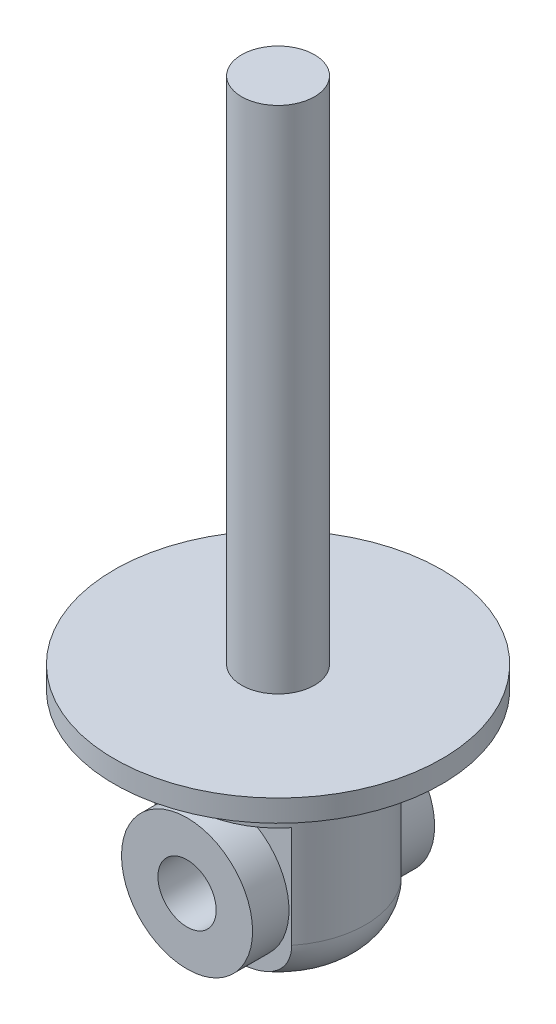
ISO-10303-21;
HEADER;
FILE_DESCRIPTION(('STEP AP214'),'2;1');
FILE_NAME('part.step','',(''),(''),'','','');
FILE_SCHEMA(('AUTOMOTIVE_DESIGN { 1 0 10303 214 1 1 1 1 }'));
ENDSEC;
DATA;
#1=APPLICATION_CONTEXT('core data for automotive mechanical design processes');
#2=APPLICATION_PROTOCOL_DEFINITION('international standard','automotive_design',2000,#1);
#3=PRODUCT_CONTEXT('',#1,'mechanical');
#4=PRODUCT('Part','Part','',(#3));
#5=PRODUCT_RELATED_PRODUCT_CATEGORY('part','',(#4));
#6=PRODUCT_DEFINITION_FORMATION('','',#4);
#7=PRODUCT_DEFINITION_CONTEXT('part definition',#1,'design');
#8=PRODUCT_DEFINITION('design','',#6,#7);
#9=PRODUCT_DEFINITION_SHAPE('','',#8);
#10=(LENGTH_UNIT() NAMED_UNIT(*) SI_UNIT(.MILLI.,.METRE.));
#11=(NAMED_UNIT(*) PLANE_ANGLE_UNIT() SI_UNIT($,.RADIAN.));
#12=(NAMED_UNIT(*) SI_UNIT($,.STERADIAN.) SOLID_ANGLE_UNIT());
#13=UNCERTAINTY_MEASURE_WITH_UNIT(LENGTH_MEASURE(1.E-05),#10,'distance_accuracy_value','');
#14=(GEOMETRIC_REPRESENTATION_CONTEXT(3) GLOBAL_UNCERTAINTY_ASSIGNED_CONTEXT((#13)) GLOBAL_UNIT_ASSIGNED_CONTEXT((#10,
#11,#12)) REPRESENTATION_CONTEXT('',''));
#15=CARTESIAN_POINT('',(0.,0.,0.));
#16=DIRECTION('',(0.,0.,1.));
#17=DIRECTION('',(1.,0.,0.));
#18=AXIS2_PLACEMENT_3D('',#15,#16,#17);
#19=CARTESIAN_POINT('',(-22.5,-11.,7.5));
#20=DIRECTION('',(0.,0.,-1.));
#21=DIRECTION('',(-1.,0.,0.));
#22=AXIS2_PLACEMENT_3D('',#19,#20,#21);
#23=PLANE('',#22);
#24=CARTESIAN_POINT('',(0.,-30.8094750193111,7.5));
#25=CARTESIAN_POINT('',(-0.184521628242417,-30.8094752958151,7.5));
#26=CARTESIAN_POINT('',(-0.369043480287189,-30.8077270322999,7.5));
#27=CARTESIAN_POINT('',(-0.737999394292283,-30.8006130628877,7.5));
#28=CARTESIAN_POINT('',(-0.922433463434383,-30.7952477367066,7.5));
#29=CARTESIAN_POINT('',(-1.29122559425462,-30.780538513706,7.5));
#30=CARTESIAN_POINT('',(-1.47558358999919,-30.7711929215574,7.5));
#31=CARTESIAN_POINT('',(-1.84401846668315,-30.7479507640883,7.5));
#32=CARTESIAN_POINT('',(-2.02809534398339,-30.734054140347,7.5));
#33=CARTESIAN_POINT('',(-2.39498843631837,-30.701027325669,7.5));
#34=CARTESIAN_POINT('',(-2.57780665418326,-30.6819201299087,7.5));
#35=CARTESIAN_POINT('',(-2.94269408038083,-30.6375682217561,7.5));
#36=CARTESIAN_POINT('',(-3.12476323156505,-30.6123230495969,7.5));
#37=CARTESIAN_POINT('',(-3.6691632505479,-30.5259360262262,7.5));
#38=CARTESIAN_POINT('',(-4.02997739530099,-30.4541196223952,7.5));
#39=CARTESIAN_POINT('',(-4.57935988961709,-30.315114172541,7.5));
#40=CARTESIAN_POINT('',(-4.77122256452969,-30.2608348848703,7.5));
#41=CARTESIAN_POINT('',(-5.15109529504942,-30.1402411036094,7.5));
#42=CARTESIAN_POINT('',(-5.33910680786539,-30.0739312594077,7.5));
#43=CARTESIAN_POINT('',(-5.70992505463463,-29.928148698992,7.5));
#44=CARTESIAN_POINT('',(-5.8927332791208,-29.8486797977089,7.5));
#45=CARTESIAN_POINT('',(-6.25155879665883,-29.6756224712841,7.5));
#46=CARTESIAN_POINT('',(-6.42757723883459,-29.5820364486502,7.5));
#47=CARTESIAN_POINT('',(-6.74413785402998,-29.3958384208508,7.5));
#48=CARTESIAN_POINT('',(-6.8859302136676,-29.3053527427416,7.5));
#49=CARTESIAN_POINT('',(-7.16205254122039,-29.1136422044668,7.5));
#50=CARTESIAN_POINT('',(-7.29638393401336,-29.0124194056704,7.5));
#51=CARTESIAN_POINT('',(-7.55627452274061,-28.7991822855038,7.5));
#52=CARTESIAN_POINT('',(-7.6818315054992,-28.6871652583255,7.5));
#53=CARTESIAN_POINT('',(-7.92270374400352,-28.4525813942248,7.5));
#54=CARTESIAN_POINT('',(-8.03801892249803,-28.3300144777409,7.5));
#55=CARTESIAN_POINT('',(-8.25792234562975,-28.0736714823962,7.5));
#56=CARTESIAN_POINT('',(-8.36240569865935,-27.9398051473305,7.5));
#57=CARTESIAN_POINT('',(-8.55796576900281,-27.662616920615,7.5));
#58=CARTESIAN_POINT('',(-8.64904436046082,-27.5192963548439,7.5));
#59=CARTESIAN_POINT('',(-8.81636481076626,-27.2243409104845,7.5));
#60=CARTESIAN_POINT('',(-8.89261579636783,-27.0727112205185,7.5));
#61=CARTESIAN_POINT('',(-9.02909243430965,-26.7624095052739,7.5));
#62=CARTESIAN_POINT('',(-9.08932115899453,-26.6037388369551,7.5));
#63=CARTESIAN_POINT('',(-9.18495143349039,-26.3052245459151,7.5));
#64=CARTESIAN_POINT('',(-9.22272405795733,-26.1661361294911,7.5));
#65=CARTESIAN_POINT('',(-9.28547940350163,-25.8851087613884,7.5));
#66=CARTESIAN_POINT('',(-9.31046370365637,-25.7431701638949,7.5));
#67=CARTESIAN_POINT('',(-9.34730641699015,-25.4576599589478,7.5));
#68=CARTESIAN_POINT('',(-9.35917031033292,-25.3140890586128,7.5));
#69=CARTESIAN_POINT('',(-9.36963164548865,-25.0264648581988,7.5));
#70=CARTESIAN_POINT('',(-9.36822954903947,-24.8824115750842,7.5));
#71=CARTESIAN_POINT('',(-9.35280339576898,-24.6061914815275,7.5));
#72=CARTESIAN_POINT('',(-9.33976569953801,-24.4739684759154,7.5));
#73=CARTESIAN_POINT('',(-9.3025636387872,-24.2110534946456,7.5));
#74=CARTESIAN_POINT('',(-9.27839574533065,-24.0803620180608,7.5));
#75=CARTESIAN_POINT('',(-9.21922065645586,-23.8215410609612,7.5));
#76=CARTESIAN_POINT('',(-9.1842198149556,-23.6934101253726,7.5));
#77=CARTESIAN_POINT('',(-9.1037455253616,-23.4404340442512,7.5));
#78=CARTESIAN_POINT('',(-9.05826815366643,-23.3155901493276,7.5));
#79=CARTESIAN_POINT('',(-8.95699564520569,-23.0692031015505,7.5));
#80=CARTESIAN_POINT('',(-8.90113499399755,-22.9476868658852,7.5));
#81=CARTESIAN_POINT('',(-8.77987692751896,-22.7094920695403,7.5));
#82=CARTESIAN_POINT('',(-8.71447610526942,-22.5928152563103,7.5));
#83=CARTESIAN_POINT('',(-8.50489875856371,-22.2509911073174,7.5));
#84=CARTESIAN_POINT('',(-8.34729299116934,-22.0339195251877,7.5));
#85=CARTESIAN_POINT('',(-7.98870608163152,-21.609337427954,7.5));
#86=CARTESIAN_POINT('',(-7.785297559506,-21.4039002281567,7.5));
#87=CARTESIAN_POINT('',(-7.35109040646742,-21.0246758733926,7.5));
#88=CARTESIAN_POINT('',(-7.12029612399674,-20.8508837047537,7.5));
#89=CARTESIAN_POINT('',(-6.69864287979114,-20.5744409595824,7.5));
#90=CARTESIAN_POINT('',(-6.51223410047272,-20.4648689537028,7.5));
#91=CARTESIAN_POINT('',(-6.13034538679085,-20.2626904112623,7.5));
#92=CARTESIAN_POINT('',(-5.93486117014358,-20.1700919878543,7.5));
#93=CARTESIAN_POINT('',(-5.53658641063457,-20.0006313082269,7.5));
#94=CARTESIAN_POINT('',(-5.33377659321379,-19.9238147555949,7.5));
#95=CARTESIAN_POINT('',(-4.92331428460809,-19.784875362625,7.5));
#96=CARTESIAN_POINT('',(-4.71566315546473,-19.7227484430634,7.5));
#97=CARTESIAN_POINT('',(-4.02250667384635,-19.5386673542947,7.5));
#98=CARTESIAN_POINT('',(-3.52942656369881,-19.4449803111871,7.5));
#99=CARTESIAN_POINT('',(-2.78498720051466,-19.3412352530644,7.5));
#100=CARTESIAN_POINT('',(-2.53568557770049,-19.3127705467372,7.5));
#101=CARTESIAN_POINT('',(-2.03612434937438,-19.2658269581612,7.5));
#102=CARTESIAN_POINT('',(-1.78586486368141,-19.2473468655649,7.5));
#103=CARTESIAN_POINT('',(-1.28363112408652,-19.2184283009414,7.5));
#104=CARTESIAN_POINT('',(-1.03165466176091,-19.208031590786,7.5));
#105=CARTESIAN_POINT('',(-0.527501194688673,-19.1941849220444,7.5));
#106=CARTESIAN_POINT('',(-0.275324180848904,-19.1907352988047,7.5));
#107=CARTESIAN_POINT('',(0.228731345602984,-19.1903333462322,7.5));
#108=CARTESIAN_POINT('',(0.480609853630182,-19.193373232494,7.5));
#109=CARTESIAN_POINT('',(0.984173581494276,-19.2063332691715,7.5));
#110=CARTESIAN_POINT('',(1.23585881660875,-19.2162528039697,7.5));
#111=CARTESIAN_POINT('',(1.76278825668935,-19.2454935008677,7.5));
#112=CARTESIAN_POINT('',(2.03798990109172,-19.2656211327378,7.5));
#113=CARTESIAN_POINT('',(2.58731345976839,-19.3180418431018,7.5));
#114=CARTESIAN_POINT('',(2.86143522597445,-19.3503365349836,7.5));
#115=CARTESIAN_POINT('',(3.40623279358437,-19.4300545548583,7.5));
#116=CARTESIAN_POINT('',(3.67691867401874,-19.4774071358833,7.5));
#117=CARTESIAN_POINT('',(4.21439476079952,-19.5907053400646,7.5));
#118=CARTESIAN_POINT('',(4.4811862031647,-19.6566449229111,7.5));
#119=CARTESIAN_POINT('',(4.94217748017443,-19.7911834026755,7.5));
#120=CARTESIAN_POINT('',(5.13778160857808,-19.8549558474619,7.5));
#121=CARTESIAN_POINT('',(5.5239942274174,-19.9961265709521,7.5));
#122=CARTESIAN_POINT('',(5.71460418712137,-20.073520789267,7.5));
#123=CARTESIAN_POINT('',(6.0892198722189,-20.2430793617625,7.5));
#124=CARTESIAN_POINT('',(6.27322442084439,-20.3352463319138,7.5));
#125=CARTESIAN_POINT('',(6.63256976145457,-20.5351759469553,7.5));
#126=CARTESIAN_POINT('',(6.80791280693598,-20.6429345063483,7.5));
#127=CARTESIAN_POINT('',(7.10989658300674,-20.8487615005737,7.5));
#128=CARTESIAN_POINT('',(7.23870103997639,-20.9436617626469,7.5));
#129=CARTESIAN_POINT('',(7.48856622066219,-21.143229826346,7.5));
#130=CARTESIAN_POINT('',(7.60962602152205,-21.2478987883735,7.5));
#131=CARTESIAN_POINT('',(7.84271387792474,-21.4668045949393,7.5));
#132=CARTESIAN_POINT('',(7.95474473789612,-21.5810384459287,7.5));
#133=CARTESIAN_POINT('',(8.16854933672494,-21.8187268203134,7.5));
#134=CARTESIAN_POINT('',(8.27032449994957,-21.9421800591116,7.5));
#135=CARTESIAN_POINT('',(8.46313596223061,-22.1987356397018,7.5));
#136=CARTESIAN_POINT('',(8.55408255407203,-22.3319055781875,7.5));
#137=CARTESIAN_POINT('',(8.72304401015934,-22.6061418402457,7.5));
#138=CARTESIAN_POINT('',(8.80106500403696,-22.747204378254,7.5));
#139=CARTESIAN_POINT('',(8.94309470867639,-23.0362068877473,7.5));
#140=CARTESIAN_POINT('',(9.00710515749598,-23.1841460034049,7.5));
#141=CARTESIAN_POINT('',(9.12014361193693,-23.4856380297523,7.5));
#142=CARTESIAN_POINT('',(9.16917373274798,-23.6391901444676,7.5));
#143=CARTESIAN_POINT('',(9.24643392787081,-23.9313639562727,7.5));
#144=CARTESIAN_POINT('',(9.27647685632879,-24.0695088202567,7.5));
#145=CARTESIAN_POINT('',(9.32406143536891,-24.3479315795213,7.5));
#146=CARTESIAN_POINT('',(9.34160421520928,-24.4882092809527,7.5));
#147=CARTESIAN_POINT('',(9.36396002322678,-24.769719609589,7.5));
#148=CARTESIAN_POINT('',(9.36877802253041,-24.9109518422674,7.5));
#149=CARTESIAN_POINT('',(9.36563613906261,-25.1932734390957,7.5));
#150=CARTESIAN_POINT('',(9.35767657732182,-25.3343628067459,7.5));
#151=CARTESIAN_POINT('',(9.32998563551062,-25.6064011749062,7.5));
#152=CARTESIAN_POINT('',(9.31102660205279,-25.7374295539783,7.5));
#153=CARTESIAN_POINT('',(9.26218788836622,-25.9974780227225,7.5));
#154=CARTESIAN_POINT('',(9.23230470755187,-26.1264974548056,7.5));
#155=CARTESIAN_POINT('',(9.16196479385525,-26.3815508516768,7.5));
#156=CARTESIAN_POINT('',(9.12151307666088,-26.5075862018084,7.5));
#157=CARTESIAN_POINT('',(9.03044888037393,-26.7559772755244,7.5));
#158=CARTESIAN_POINT('',(8.97983258590813,-26.8783315975104,7.5));
#159=CARTESIAN_POINT('',(8.8680617574251,-27.1205569584555,7.5));
#160=CARTESIAN_POINT('',(8.80674877020291,-27.2403549182387,7.5));
#161=CARTESIAN_POINT('',(8.67480187441993,-27.4747211723639,7.5));
#162=CARTESIAN_POINT('',(8.60416462323317,-27.5892875713423,7.5));
#163=CARTESIAN_POINT('',(8.37928997825773,-27.9242270275788,7.5));
#164=CARTESIAN_POINT('',(8.21201407264852,-28.13600210755,7.5));
#165=CARTESIAN_POINT('',(7.83294273917801,-28.5504485361803,7.5));
#166=CARTESIAN_POINT('',(7.618532285847,-28.7507010772538,7.5));
#167=CARTESIAN_POINT('',(7.16337882817299,-29.1185076671662,7.5));
#168=CARTESIAN_POINT('',(6.9226275303298,-29.2860513710234,7.5));
#169=CARTESIAN_POINT('',(6.4788664395953,-29.5545024709803,7.5));
#170=CARTESIAN_POINT('',(6.279707295078,-29.6619013252763,7.5));
#171=CARTESIAN_POINT('',(5.87254463104013,-29.858559219587,7.5));
#172=CARTESIAN_POINT('',(5.66453691936401,-29.9478095430477,7.5));
#173=CARTESIAN_POINT('',(5.24180758530233,-30.1096214973705,7.5));
#174=CARTESIAN_POINT('',(5.02707553901332,-30.1821555960046,7.5));
#175=CARTESIAN_POINT('',(4.59305326757357,-30.3121001369762,7.5));
#176=CARTESIAN_POINT('',(4.37376133898657,-30.3695048137837,7.5));
#177=CARTESIAN_POINT('',(3.81417726059938,-30.4981886749365,7.5));
#178=CARTESIAN_POINT('',(3.4718329690517,-30.5604951716191,7.5));
#179=CARTESIAN_POINT('',(2.7835920061487,-30.6609019684328,7.5));
#180=CARTESIAN_POINT('',(2.43769315620306,-30.6989863972919,7.5));
#181=CARTESIAN_POINT('',(1.91723181279188,-30.7425563308733,7.5));
#182=CARTESIAN_POINT('',(1.74318957751327,-30.7548291128016,7.5));
#183=CARTESIAN_POINT('',(1.39487161182968,-30.7753986995787,7.5));
#184=CARTESIAN_POINT('',(1.22059588725639,-30.7836956019396,7.5));
#185=CARTESIAN_POINT('',(0.871965392986042,-30.796777523185,7.5));
#186=CARTESIAN_POINT('',(0.697610658492173,-30.8015635129394,7.5));
#187=CARTESIAN_POINT('',(0.348837350643896,-30.8079121855994,7.5));
#188=CARTESIAN_POINT('',(0.17441877530504,-30.8094747579462,7.5));
#189=CARTESIAN_POINT('',(0.,-30.8094750193111,7.5));
#190=B_SPLINE_CURVE_WITH_KNOTS('',3,(#24,#25,#26,#27,#28,#29,#30,#31,#32,#33,#34,#35,#36,#37,
#38,#39,#40,#41,#42,#43,#44,#45,#46,#47,#48,#49,#50,#51,#52,#53,#54,#55,#56,#57,#58,#59,#60,#61,
#62,#63,#64,#65,#66,#67,#68,#69,#70,#71,#72,#73,#74,#75,#76,#77,#78,#79,#80,#81,#82,#83,#84,#85,
#86,#87,#88,#89,#90,#91,#92,#93,#94,#95,#96,#97,#98,#99,#100,#101,#102,#103,#104,#105,#106,#107,
#108,#109,#110,#111,#112,#113,#114,#115,#116,#117,#118,#119,#120,#121,#122,#123,#124,#125,#126,
#127,#128,#129,#130,#131,#132,#133,#134,#135,#136,#137,#138,#139,#140,#141,#142,#143,#144,#145,
#146,#147,#148,#149,#150,#151,#152,#153,#154,#155,#156,#157,#158,#159,#160,#161,#162,#163,#164,
#165,#166,#167,#168,#169,#170,#171,#172,#173,#174,#175,#176,#177,#178,#179,#180,#181,#182,#183,
#184,#185,#186,#187,#188,#189),.UNSPECIFIED.,.T.,.F.,(4,2,2,2,2,2,2,2,2,2,2,2,2,2,2,2,2,2,2,2,2,
2,2,2,2,2,2,2,2,2,2,2,2,2,2,2,2,2,2,2,2,2,2,2,2,2,2,2,2,2,2,2,2,2,2,2,2,2,2,2,2,2,2,2,2,2,2,2,2,
2,2,2,2,2,2,2,2,2,2,2,2,2,4),(0.,0.553556541747909,1.10705498067111,1.66078940935171,
2.21453094651203,2.7658672034967,3.31724477121585,4.41912680182767,5.01698525599297,
5.61461314908642,6.21206808675634,6.80942146164093,7.31357153503217,7.81762499361292,
8.32180513447662,8.82598907791494,9.33467160980089,9.84328295415677,10.3515802378956,
10.8597799828438,11.291588037567,11.7233427606026,12.1549170790764,12.5864763761707,
12.9845986570771,13.3828472534997,13.7808627038906,14.1790274594522,14.579795450788,
14.9807069160888,15.7821103743006,16.6461503316802,17.5100532757815,18.1578732554314,
18.8060020817716,19.4559821948789,20.1057815998326,21.6069748462106,22.3596793389022,
23.1122925673176,23.8687687149109,24.6252813779039,25.3808870860739,26.1364251884592,
26.9640249034878,27.7917343993232,28.6156111127982,29.4392203950451,30.0559954213972,
30.6725869093733,31.2892877047367,31.9058271963483,32.3853559200308,32.8649416785199,
33.3443778968313,33.823747436381,34.3068464150843,34.7897156366604,35.2725249226045,
35.7552660053908,36.1788379642465,36.6023716529343,37.0257398573389,37.4490974249689,
37.8458122806135,38.2426543730445,38.639308470493,39.0361117351622,39.4393886143668,
39.8428104576492,40.6491243408277,41.5260051520067,42.403162850804,43.0810551134699,
43.7592721958252,44.4385984678267,45.1181832448308,46.1608437011148,47.2041866484774,
47.7275747628343,48.2509500399341,48.7741805338585,49.2974289735857),.UNSPECIFIED.);
#191=CARTESIAN_POINT('',(9.3674969975976,-25.,7.5));
#192=VERTEX_POINT('',#191);
#193=CARTESIAN_POINT('',(-9.36749699759765,-24.9999999999999,7.5));
#194=VERTEX_POINT('',#193);
#195=EDGE_CURVE('E58',#192,#194,#190,.T.);
#196=ORIENTED_EDGE('',*,*,#195,.F.);
#197=DIRECTION('',(0.,1.,0.));
#198=VECTOR('',#197,1.);
#199=CARTESIAN_POINT('',(9.36749699759759,-3.,7.5));
#200=LINE('',#199,#198);
#201=CARTESIAN_POINT('',(9.36749699759759,-11.,7.5));
#202=VERTEX_POINT('',#201);
#203=EDGE_CURVE('E96',#202,#192,#200,.F.);
#204=ORIENTED_EDGE('',*,*,#203,.F.);
#205=DIRECTION('',(1.,0.,0.));
#206=VECTOR('',#205,1.);
#207=CARTESIAN_POINT('',(-22.5,-11.,7.5));
#208=LINE('',#207,#206);
#209=CARTESIAN_POINT('',(-9.36749699759761,-11.,7.5));
#210=VERTEX_POINT('',#209);
#211=EDGE_CURVE('E87',#210,#202,#208,.T.);
#212=ORIENTED_EDGE('',*,*,#211,.F.);
#213=DIRECTION('',(0.,1.,0.));
#214=VECTOR('',#213,1.);
#215=CARTESIAN_POINT('',(-9.36749699759761,-3.,7.5));
#216=LINE('',#215,#214);
#217=EDGE_CURVE('E44',#194,#210,#216,.T.);
#218=ORIENTED_EDGE('',*,*,#217,.F.);
#219=EDGE_LOOP('',(#196,#204,#212,#218));
#220=FACE_BOUND('',#219,.T.);
#221=CARTESIAN_POINT('',(0.,-21.,7.5));
#222=DIRECTION('',(0.,0.,-1.));
#223=DIRECTION('',(-1.,0.,0.));
#224=AXIS2_PLACEMENT_3D('',#221,#222,#223);
#225=CIRCLE('',#224,9.);
#226=CARTESIAN_POINT('',(-9.,-21.,7.5));
#227=VERTEX_POINT('',#226);
#228=EDGE_CURVE('E11',#227,#227,#225,.F.);
#229=ORIENTED_EDGE('',*,*,#228,.F.);
#230=EDGE_LOOP('',(#229));
#231=FACE_BOUND('',#230,.T.);
#232=ADVANCED_FACE('F36',(#220,#231),#23,.F.);
#233=CARTESIAN_POINT('',(0.,70.,0.));
#234=DIRECTION('',(0.,1.,0.));
#235=DIRECTION('',(0.,0.,1.));
#236=AXIS2_PLACEMENT_3D('',#233,#234,#235);
#237=CYLINDRICAL_SURFACE('',#236,4.99999999999999);
#238=CARTESIAN_POINT('',(0.,70.,0.));
#239=DIRECTION('',(0.,1.,0.));
#240=DIRECTION('',(0.,0.,1.));
#241=AXIS2_PLACEMENT_3D('',#238,#239,#240);
#242=CIRCLE('',#241,5.);
#243=CARTESIAN_POINT('',(0.,70.,5.00000000000002));
#244=VERTEX_POINT('',#243);
#245=EDGE_CURVE('E81',#244,#244,#242,.T.);
#246=ORIENTED_EDGE('',*,*,#245,.F.);
#247=EDGE_LOOP('',(#246));
#248=FACE_BOUND('',#247,.T.);
#249=CARTESIAN_POINT('',(0.,0.,0.));
#250=DIRECTION('',(0.,1.,0.));
#251=DIRECTION('',(0.,0.,1.));
#252=AXIS2_PLACEMENT_3D('',#249,#250,#251);
#253=CIRCLE('',#252,4.99999999999998);
#254=CARTESIAN_POINT('',(0.,0.,4.99999999999998));
#255=VERTEX_POINT('',#254);
#256=EDGE_CURVE('E174',#255,#255,#253,.T.);
#257=ORIENTED_EDGE('',*,*,#256,.T.);
#258=EDGE_LOOP('',(#257));
#259=FACE_BOUND('',#258,.T.);
#260=ADVANCED_FACE('F38',(#248,#259),#237,.T.);
#261=CARTESIAN_POINT('',(0.,70.,0.));
#262=DIRECTION('',(0.,-1.,0.));
#263=DIRECTION('',(0.,0.,-1.));
#264=AXIS2_PLACEMENT_3D('',#261,#262,#263);
#265=PLANE('',#264);
#266=ORIENTED_EDGE('',*,*,#245,.T.);
#267=EDGE_LOOP('',(#266));
#268=FACE_BOUND('',#267,.T.);
#269=ADVANCED_FACE('F164',(#268),#265,.F.);
#270=CARTESIAN_POINT('',(0.,-3.,0.));
#271=DIRECTION('',(0.,1.,0.));
#272=DIRECTION('',(0.,0.,1.));
#273=AXIS2_PLACEMENT_3D('',#270,#271,#272);
#274=CYLINDRICAL_SURFACE('',#273,22.5);
#275=CARTESIAN_POINT('',(0.,-3.,0.));
#276=DIRECTION('',(0.,-1.,0.));
#277=DIRECTION('',(0.,0.,-1.));
#278=AXIS2_PLACEMENT_3D('',#275,#276,#277);
#279=CIRCLE('',#278,22.5);
#280=CARTESIAN_POINT('',(0.,-2.99999999999999,-22.5));
#281=VERTEX_POINT('',#280);
#282=EDGE_CURVE('E177',#281,#281,#279,.T.);
#283=ORIENTED_EDGE('',*,*,#282,.F.);
#284=EDGE_LOOP('',(#283));
#285=FACE_BOUND('',#284,.T.);
#286=CARTESIAN_POINT('',(0.,0.,0.));
#287=DIRECTION('',(0.,-1.,0.));
#288=DIRECTION('',(0.,0.,-1.));
#289=AXIS2_PLACEMENT_3D('',#286,#287,#288);
#290=CIRCLE('',#289,22.5);
#291=CARTESIAN_POINT('',(0.,0.,-22.5));
#292=VERTEX_POINT('',#291);
#293=EDGE_CURVE('E180',#292,#292,#290,.T.);
#294=ORIENTED_EDGE('',*,*,#293,.T.);
#295=EDGE_LOOP('',(#294));
#296=FACE_BOUND('',#295,.T.);
#297=ADVANCED_FACE('F160',(#285,#296),#274,.T.);
#298=CARTESIAN_POINT('',(0.,-3.,0.));
#299=DIRECTION('',(0.,-1.,0.));
#300=DIRECTION('',(0.,0.,-1.));
#301=AXIS2_PLACEMENT_3D('',#298,#299,#300);
#302=PLANE('',#301);
#303=CARTESIAN_POINT('',(0.,-3.,0.));
#304=DIRECTION('',(0.,1.,0.));
#305=DIRECTION('',(-1.,0.,0.));
#306=AXIS2_PLACEMENT_3D('',#303,#304,#305);
#307=CIRCLE('',#306,12.);
#308=CARTESIAN_POINT('',(-12.,-3.00000000000001,0.));
#309=VERTEX_POINT('',#308);
#310=EDGE_CURVE('E112',#309,#309,#307,.T.);
#311=ORIENTED_EDGE('',*,*,#310,.T.);
#312=EDGE_LOOP('',(#311));
#313=FACE_BOUND('',#312,.T.);
#314=ORIENTED_EDGE('',*,*,#282,.T.);
#315=EDGE_LOOP('',(#314));
#316=FACE_BOUND('',#315,.T.);
#317=ADVANCED_FACE('F154',(#313,#316),#302,.T.);
#318=CARTESIAN_POINT('',(0.,0.,0.));
#319=DIRECTION('',(0.,-1.,0.));
#320=DIRECTION('',(0.,0.,-1.));
#321=AXIS2_PLACEMENT_3D('',#318,#319,#320);
#322=PLANE('',#321);
#323=ORIENTED_EDGE('',*,*,#256,.F.);
#324=EDGE_LOOP('',(#323));
#325=FACE_BOUND('',#324,.T.);
#326=ORIENTED_EDGE('',*,*,#293,.F.);
#327=EDGE_LOOP('',(#326));
#328=FACE_BOUND('',#327,.T.);
#329=ADVANCED_FACE('F149',(#325,#328),#322,.F.);
#330=CARTESIAN_POINT('',(0.,-31.,0.));
#331=DIRECTION('',(0.,1.,0.));
#332=DIRECTION('',(-1.,0.,0.));
#333=AXIS2_PLACEMENT_3D('',#330,#331,#332);
#334=PLANE('',#333);
#335=CARTESIAN_POINT('',(0.,-31.,0.));
#336=DIRECTION('',(0.,1.,0.));
#337=DIRECTION('',(-1.,0.,0.));
#338=AXIS2_PLACEMENT_3D('',#335,#336,#337);
#339=CIRCLE('',#338,5.99999999999996);
#340=CARTESIAN_POINT('',(-5.99999999999995,-31.,0.));
#341=VERTEX_POINT('',#340);
#342=EDGE_CURVE('E183',#341,#341,#339,.T.);
#343=ORIENTED_EDGE('',*,*,#342,.F.);
#344=EDGE_LOOP('',(#343));
#345=FACE_BOUND('',#344,.T.);
#346=ADVANCED_FACE('F145',(#345),#334,.F.);
#347=CARTESIAN_POINT('',(0.,-25.,0.));
#348=DIRECTION('',(0.,1.,0.));
#349=DIRECTION('',(-1.,0.,0.));
#350=AXIS2_PLACEMENT_3D('',#347,#348,#349);
#351=TOROIDAL_SURFACE('',#350,6.,6.);
#352=CARTESIAN_POINT('',(0.,-25.,0.));
#353=DIRECTION('',(0.,1.,0.));
#354=DIRECTION('',(-1.,0.,0.));
#355=AXIS2_PLACEMENT_3D('',#352,#353,#354);
#356=CIRCLE('',#355,12.);
#357=CARTESIAN_POINT('',(9.36749699759766,-24.9999999999999,-7.5));
#358=VERTEX_POINT('',#357);
#359=EDGE_CURVE('E95',#192,#358,#356,.T.);
#360=ORIENTED_EDGE('',*,*,#359,.F.);
#361=ORIENTED_EDGE('',*,*,#195,.T.);
#362=CARTESIAN_POINT('',(-9.3674969975976,-25.,-7.5));
#363=VERTEX_POINT('',#362);
#364=EDGE_CURVE('E105',#363,#194,#356,.T.);
#365=ORIENTED_EDGE('',*,*,#364,.F.);
#366=CARTESIAN_POINT('',(0.,-30.8094750193111,-7.5));
#367=CARTESIAN_POINT('',(0.184521628242422,-30.8094752958151,-7.5));
#368=CARTESIAN_POINT('',(0.369043480287194,-30.8077270322999,-7.5));
#369=CARTESIAN_POINT('',(0.737999394292287,-30.8006130628877,-7.5));
#370=CARTESIAN_POINT('',(0.922433463434387,-30.7952477367066,-7.5));
#371=CARTESIAN_POINT('',(1.29122559425462,-30.780538513706,-7.5));
#372=CARTESIAN_POINT('',(1.47558358999919,-30.7711929215574,-7.5));
#373=CARTESIAN_POINT('',(1.84401846668315,-30.7479507640883,-7.5));
#374=CARTESIAN_POINT('',(2.0280953439834,-30.734054140347,-7.5));
#375=CARTESIAN_POINT('',(2.39498843631837,-30.701027325669,-7.5));
#376=CARTESIAN_POINT('',(2.57780665418327,-30.6819201299087,-7.5));
#377=CARTESIAN_POINT('',(2.94269408038084,-30.6375682217561,-7.5));
#378=CARTESIAN_POINT('',(3.12476323156505,-30.6123230495969,-7.5));
#379=CARTESIAN_POINT('',(3.6691632505479,-30.5259360262262,-7.5));
#380=CARTESIAN_POINT('',(4.02997739530099,-30.4541196223952,-7.5));
#381=CARTESIAN_POINT('',(4.57935988961709,-30.315114172541,-7.5));
#382=CARTESIAN_POINT('',(4.7712225645297,-30.2608348848703,-7.5));
#383=CARTESIAN_POINT('',(5.15109529504943,-30.1402411036094,-7.5));
#384=CARTESIAN_POINT('',(5.3391068078654,-30.0739312594077,-7.5));
#385=CARTESIAN_POINT('',(5.70992505463464,-29.928148698992,-7.5));
#386=CARTESIAN_POINT('',(5.8927332791208,-29.8486797977089,-7.5));
#387=CARTESIAN_POINT('',(6.25155879665884,-29.6756224712841,-7.5));
#388=CARTESIAN_POINT('',(6.4275772388346,-29.5820364486502,-7.5));
#389=CARTESIAN_POINT('',(6.74413785402998,-29.3958384208508,-7.5));
#390=CARTESIAN_POINT('',(6.8859302136676,-29.3053527427416,-7.5));
#391=CARTESIAN_POINT('',(7.16205254122039,-29.1136422044668,-7.5));
#392=CARTESIAN_POINT('',(7.29638393401337,-29.0124194056704,-7.5));
#393=CARTESIAN_POINT('',(7.55627452274062,-28.7991822855038,-7.5));
#394=CARTESIAN_POINT('',(7.6818315054992,-28.6871652583255,-7.5));
#395=CARTESIAN_POINT('',(7.92270374400352,-28.4525813942248,-7.5));
#396=CARTESIAN_POINT('',(8.03801892249803,-28.3300144777409,-7.5));
#397=CARTESIAN_POINT('',(8.25792234562975,-28.0736714823962,-7.5));
#398=CARTESIAN_POINT('',(8.36240569865935,-27.9398051473305,-7.5));
#399=CARTESIAN_POINT('',(8.55796576900282,-27.662616920615,-7.5));
#400=CARTESIAN_POINT('',(8.64904436046083,-27.5192963548439,-7.5));
#401=CARTESIAN_POINT('',(8.81636481076627,-27.2243409104845,-7.5));
#402=CARTESIAN_POINT('',(8.89261579636783,-27.0727112205185,-7.5));
#403=CARTESIAN_POINT('',(9.02909243430965,-26.7624095052739,-7.5));
#404=CARTESIAN_POINT('',(9.08932115899453,-26.6037388369551,-7.5));
#405=CARTESIAN_POINT('',(9.1849514334904,-26.3052245459151,-7.5));
#406=CARTESIAN_POINT('',(9.22272405795733,-26.1661361294911,-7.5));
#407=CARTESIAN_POINT('',(9.28547940350164,-25.8851087613884,-7.5));
#408=CARTESIAN_POINT('',(9.31046370365637,-25.7431701638949,-7.5));
#409=CARTESIAN_POINT('',(9.34730641699016,-25.4576599589478,-7.5));
#410=CARTESIAN_POINT('',(9.35917031033292,-25.3140890586128,-7.5));
#411=CARTESIAN_POINT('',(9.36963164548865,-25.0264648581988,-7.5));
#412=CARTESIAN_POINT('',(9.36822954903947,-24.8824115750842,-7.5));
#413=CARTESIAN_POINT('',(9.35280339576898,-24.6061914815275,-7.5));
#414=CARTESIAN_POINT('',(9.33976569953801,-24.4739684759154,-7.5));
#415=CARTESIAN_POINT('',(9.30256363878721,-24.2110534946456,-7.5));
#416=CARTESIAN_POINT('',(9.27839574533066,-24.0803620180608,-7.5));
#417=CARTESIAN_POINT('',(9.21922065645586,-23.8215410609612,-7.5));
#418=CARTESIAN_POINT('',(9.1842198149556,-23.6934101253726,-7.5));
#419=CARTESIAN_POINT('',(9.1037455253616,-23.4404340442512,-7.5));
#420=CARTESIAN_POINT('',(9.05826815366643,-23.3155901493276,-7.5));
#421=CARTESIAN_POINT('',(8.95699564520569,-23.0692031015505,-7.5));
#422=CARTESIAN_POINT('',(8.90113499399755,-22.9476868658852,-7.5));
#423=CARTESIAN_POINT('',(8.77987692751896,-22.7094920695403,-7.5));
#424=CARTESIAN_POINT('',(8.71447610526943,-22.5928152563103,-7.5));
#425=CARTESIAN_POINT('',(8.50489875856371,-22.2509911073174,-7.5));
#426=CARTESIAN_POINT('',(8.34729299116934,-22.0339195251877,-7.5));
#427=CARTESIAN_POINT('',(7.98870608163152,-21.609337427954,-7.5));
#428=CARTESIAN_POINT('',(7.78529755950601,-21.4039002281567,-7.5));
#429=CARTESIAN_POINT('',(7.35109040646742,-21.0246758733926,-7.5));
#430=CARTESIAN_POINT('',(7.12029612399674,-20.8508837047537,-7.5));
#431=CARTESIAN_POINT('',(6.69864287979115,-20.5744409595824,-7.5));
#432=CARTESIAN_POINT('',(6.51223410047273,-20.4648689537028,-7.5));
#433=CARTESIAN_POINT('',(6.13034538679086,-20.2626904112623,-7.5));
#434=CARTESIAN_POINT('',(5.93486117014358,-20.1700919878543,-7.5));
#435=CARTESIAN_POINT('',(5.53658641063457,-20.0006313082269,-7.5));
#436=CARTESIAN_POINT('',(5.3337765932138,-19.9238147555949,-7.5));
#437=CARTESIAN_POINT('',(4.9233142846081,-19.784875362625,-7.5));
#438=CARTESIAN_POINT('',(4.71566315546474,-19.7227484430634,-7.5));
#439=CARTESIAN_POINT('',(4.02250667384636,-19.5386673542947,-7.5));
#440=CARTESIAN_POINT('',(3.52942656369882,-19.4449803111871,-7.5));
#441=CARTESIAN_POINT('',(2.78498720051467,-19.3412352530644,-7.5));
#442=CARTESIAN_POINT('',(2.53568557770051,-19.3127705467372,-7.5));
#443=CARTESIAN_POINT('',(2.03612434937439,-19.2658269581612,-7.5));
#444=CARTESIAN_POINT('',(1.78586486368143,-19.2473468655649,-7.5));
#445=CARTESIAN_POINT('',(1.28363112408654,-19.2184283009414,-7.5));
#446=CARTESIAN_POINT('',(1.03165466176093,-19.208031590786,-7.5));
#447=CARTESIAN_POINT('',(0.527501194688697,-19.1941849220444,-7.5));
#448=CARTESIAN_POINT('',(0.275324180848929,-19.1907352988047,-7.5));
#449=CARTESIAN_POINT('',(-0.228731345602956,-19.1903333462322,-7.5));
#450=CARTESIAN_POINT('',(-0.480609853630154,-19.193373232494,-7.5));
#451=CARTESIAN_POINT('',(-0.984173581494245,-19.2063332691715,-7.5));
#452=CARTESIAN_POINT('',(-1.23585881660872,-19.2162528039697,-7.5));
#453=CARTESIAN_POINT('',(-1.76278825668931,-19.2454935008677,-7.5));
#454=CARTESIAN_POINT('',(-2.03798990109169,-19.2656211327378,-7.5));
#455=CARTESIAN_POINT('',(-2.58731345976837,-19.3180418431018,-7.5));
#456=CARTESIAN_POINT('',(-2.86143522597442,-19.3503365349836,-7.5));
#457=CARTESIAN_POINT('',(-3.40623279358436,-19.4300545548583,-7.5));
#458=CARTESIAN_POINT('',(-3.67691867401872,-19.4774071358833,-7.5));
#459=CARTESIAN_POINT('',(-4.21439476079951,-19.5907053400646,-7.5));
#460=CARTESIAN_POINT('',(-4.4811862031647,-19.6566449229111,-7.5));
#461=CARTESIAN_POINT('',(-4.94217748017442,-19.7911834026755,-7.5));
#462=CARTESIAN_POINT('',(-5.13778160857807,-19.8549558474619,-7.5));
#463=CARTESIAN_POINT('',(-5.52399422741739,-19.9961265709521,-7.5));
#464=CARTESIAN_POINT('',(-5.71460418712136,-20.073520789267,-7.5));
#465=CARTESIAN_POINT('',(-6.08921987221889,-20.2430793617625,-7.5));
#466=CARTESIAN_POINT('',(-6.27322442084438,-20.3352463319138,-7.5));
#467=CARTESIAN_POINT('',(-6.63256976145457,-20.5351759469553,-7.5));
#468=CARTESIAN_POINT('',(-6.80791280693597,-20.6429345063483,-7.5));
#469=CARTESIAN_POINT('',(-7.10989658300674,-20.8487615005737,-7.5));
#470=CARTESIAN_POINT('',(-7.23870103997639,-20.9436617626469,-7.5));
#471=CARTESIAN_POINT('',(-7.48856622066219,-21.143229826346,-7.5));
#472=CARTESIAN_POINT('',(-7.60962602152205,-21.2478987883735,-7.5));
#473=CARTESIAN_POINT('',(-7.84271387792474,-21.4668045949393,-7.5));
#474=CARTESIAN_POINT('',(-7.95474473789612,-21.5810384459287,-7.5));
#475=CARTESIAN_POINT('',(-8.16854933672494,-21.8187268203134,-7.5));
#476=CARTESIAN_POINT('',(-8.27032449994956,-21.9421800591116,-7.5));
#477=CARTESIAN_POINT('',(-8.46313596223061,-22.1987356397018,-7.5));
#478=CARTESIAN_POINT('',(-8.55408255407202,-22.3319055781875,-7.5));
#479=CARTESIAN_POINT('',(-8.72304401015933,-22.6061418402457,-7.5));
#480=CARTESIAN_POINT('',(-8.80106500403695,-22.747204378254,-7.5));
#481=CARTESIAN_POINT('',(-8.94309470867638,-23.0362068877473,-7.5));
#482=CARTESIAN_POINT('',(-9.00710515749597,-23.1841460034049,-7.5));
#483=CARTESIAN_POINT('',(-9.12014361193692,-23.4856380297523,-7.5));
#484=CARTESIAN_POINT('',(-9.16917373274798,-23.6391901444676,-7.5));
#485=CARTESIAN_POINT('',(-9.24643392787081,-23.9313639562727,-7.5));
#486=CARTESIAN_POINT('',(-9.27647685632879,-24.0695088202567,-7.5));
#487=CARTESIAN_POINT('',(-9.32406143536891,-24.3479315795213,-7.5));
#488=CARTESIAN_POINT('',(-9.34160421520928,-24.4882092809527,-7.5));
#489=CARTESIAN_POINT('',(-9.36396002322678,-24.769719609589,-7.5));
#490=CARTESIAN_POINT('',(-9.3687780225304,-24.9109518422674,-7.5));
#491=CARTESIAN_POINT('',(-9.3656361390626,-25.1932734390957,-7.5));
#492=CARTESIAN_POINT('',(-9.35767657732181,-25.3343628067459,-7.5));
#493=CARTESIAN_POINT('',(-9.32998563551062,-25.6064011749062,-7.5));
#494=CARTESIAN_POINT('',(-9.31102660205278,-25.7374295539783,-7.5));
#495=CARTESIAN_POINT('',(-9.26218788836622,-25.9974780227225,-7.5));
#496=CARTESIAN_POINT('',(-9.23230470755187,-26.1264974548056,-7.5));
#497=CARTESIAN_POINT('',(-9.16196479385525,-26.3815508516768,-7.5));
#498=CARTESIAN_POINT('',(-9.12151307666088,-26.5075862018084,-7.5));
#499=CARTESIAN_POINT('',(-9.03044888037393,-26.7559772755244,-7.5));
#500=CARTESIAN_POINT('',(-8.97983258590813,-26.8783315975104,-7.5));
#501=CARTESIAN_POINT('',(-8.8680617574251,-27.1205569584555,-7.5));
#502=CARTESIAN_POINT('',(-8.8067487702029,-27.2403549182387,-7.5));
#503=CARTESIAN_POINT('',(-8.67480187441992,-27.4747211723639,-7.5));
#504=CARTESIAN_POINT('',(-8.60416462323316,-27.5892875713423,-7.5));
#505=CARTESIAN_POINT('',(-8.37928997825773,-27.9242270275788,-7.5));
#506=CARTESIAN_POINT('',(-8.21201407264852,-28.1360021075501,-7.5));
#507=CARTESIAN_POINT('',(-7.832942739178,-28.5504485361803,-7.5));
#508=CARTESIAN_POINT('',(-7.61853228584699,-28.7507010772538,-7.5));
#509=CARTESIAN_POINT('',(-7.16337882817298,-29.1185076671662,-7.5));
#510=CARTESIAN_POINT('',(-6.92262753032979,-29.2860513710234,-7.5));
#511=CARTESIAN_POINT('',(-6.4788664395953,-29.5545024709803,-7.5));
#512=CARTESIAN_POINT('',(-6.279707295078,-29.6619013252763,-7.5));
#513=CARTESIAN_POINT('',(-5.87254463104013,-29.858559219587,-7.5));
#514=CARTESIAN_POINT('',(-5.66453691936401,-29.9478095430478,-7.5));
#515=CARTESIAN_POINT('',(-5.24180758530233,-30.1096214973705,-7.5));
#516=CARTESIAN_POINT('',(-5.02707553901332,-30.1821555960046,-7.5));
#517=CARTESIAN_POINT('',(-4.59305326757357,-30.3121001369762,-7.5));
#518=CARTESIAN_POINT('',(-4.37376133898657,-30.3695048137837,-7.5));
#519=CARTESIAN_POINT('',(-3.81417726059937,-30.4981886749365,-7.5));
#520=CARTESIAN_POINT('',(-3.4718329690517,-30.5604951716191,-7.5));
#521=CARTESIAN_POINT('',(-2.7835920061487,-30.6609019684328,-7.5));
#522=CARTESIAN_POINT('',(-2.43769315620306,-30.6989863972919,-7.5));
#523=CARTESIAN_POINT('',(-1.91723181279188,-30.7425563308733,-7.5));
#524=CARTESIAN_POINT('',(-1.74318957751327,-30.7548291128016,-7.5));
#525=CARTESIAN_POINT('',(-1.39487161182967,-30.7753986995787,-7.5));
#526=CARTESIAN_POINT('',(-1.22059588725639,-30.7836956019396,-7.5));
#527=CARTESIAN_POINT('',(-0.871965392986042,-30.796777523185,-7.5));
#528=CARTESIAN_POINT('',(-0.697610658492172,-30.8015635129394,-7.5));
#529=CARTESIAN_POINT('',(-0.348837350643892,-30.8079121855994,-7.5));
#530=CARTESIAN_POINT('',(-0.174418775305036,-30.8094747579462,-7.5));
#531=CARTESIAN_POINT('',(0.,-30.8094750193111,-7.5));
#532=B_SPLINE_CURVE_WITH_KNOTS('',3,(#366,#367,#368,#369,#370,#371,#372,#373,#374,#375,#376,
#377,#378,#379,#380,#381,#382,#383,#384,#385,#386,#387,#388,#389,#390,#391,#392,#393,#394,#395,
#396,#397,#398,#399,#400,#401,#402,#403,#404,#405,#406,#407,#408,#409,#410,#411,#412,#413,#414,
#415,#416,#417,#418,#419,#420,#421,#422,#423,#424,#425,#426,#427,#428,#429,#430,#431,#432,#433,
#434,#435,#436,#437,#438,#439,#440,#441,#442,#443,#444,#445,#446,#447,#448,#449,#450,#451,#452,
#453,#454,#455,#456,#457,#458,#459,#460,#461,#462,#463,#464,#465,#466,#467,#468,#469,#470,#471,
#472,#473,#474,#475,#476,#477,#478,#479,#480,#481,#482,#483,#484,#485,#486,#487,#488,#489,#490,
#491,#492,#493,#494,#495,#496,#497,#498,#499,#500,#501,#502,#503,#504,#505,#506,#507,#508,#509,
#510,#511,#512,#513,#514,#515,#516,#517,#518,#519,#520,#521,#522,#523,#524,#525,#526,#527,#528,
#529,#530,#531),.UNSPECIFIED.,.T.,.F.,(4,2,2,2,2,2,2,2,2,2,2,2,2,2,2,2,2,2,2,2,2,2,2,2,2,2,2,2,
2,2,2,2,2,2,2,2,2,2,2,2,2,2,2,2,2,2,2,2,2,2,2,2,2,2,2,2,2,2,2,2,2,2,2,2,2,2,2,2,2,2,2,2,2,2,2,2,
2,2,2,2,2,2,4),(0.,0.553556541747908,1.10705498067111,1.66078940935171,2.21453094651203,
2.7658672034967,3.31724477121585,4.41912680182767,5.01698525599297,5.61461314908642,
6.21206808675634,6.80942146164093,7.31357153503217,7.81762499361292,8.32180513447662,
8.82598907791493,9.33467160980088,9.84328295415676,10.3515802378956,10.8597799828438,
11.291588037567,11.7233427606026,12.1549170790764,12.5864763761707,12.9845986570771,
13.3828472534997,13.7808627038906,14.1790274594522,14.5797954507881,14.9807069160888,
15.7821103743006,16.6461503316802,17.5100532757815,18.1578732554314,18.8060020817716,
19.4559821948789,20.1057815998326,21.6069748462105,22.3596793389022,23.1122925673176,
23.8687687149109,24.6252813779039,25.3808870860738,26.1364251884592,26.9640249034878,
27.7917343993232,28.6156111127982,29.4392203950451,30.0559954213971,30.6725869093732,
31.2892877047367,31.9058271963483,32.3853559200308,32.8649416785199,33.3443778968313,
33.823747436381,34.3068464150843,34.7897156366603,35.2725249226045,35.7552660053908,
36.1788379642465,36.6023716529343,37.0257398573389,37.4490974249689,37.8458122806135,
38.2426543730445,38.639308470493,39.0361117351622,39.4393886143668,39.8428104576491,
40.6491243408277,41.5260051520067,42.4031628508039,43.0810551134699,43.7592721958252,
44.4385984678267,45.1181832448308,46.1608437011148,47.2041866484774,47.7275747628343,
48.2509500399341,48.7741805338585,49.2974289735857),.UNSPECIFIED.);
#533=EDGE_CURVE('E113',#363,#358,#532,.T.);
#534=ORIENTED_EDGE('',*,*,#533,.T.);
#535=EDGE_LOOP('',(#360,#361,#365,#534));
#536=FACE_BOUND('',#535,.T.);
#537=ORIENTED_EDGE('',*,*,#342,.T.);
#538=EDGE_LOOP('',(#537));
#539=FACE_BOUND('',#538,.T.);
#540=ADVANCED_FACE('F110',(#536,#539),#351,.T.);
#541=CARTESIAN_POINT('',(0.,-3.,0.));
#542=DIRECTION('',(0.,1.,0.));
#543=DIRECTION('',(-1.,0.,0.));
#544=AXIS2_PLACEMENT_3D('',#541,#542,#543);
#545=CYLINDRICAL_SURFACE('',#544,12.);
#546=ORIENTED_EDGE('',*,*,#217,.T.);
#547=CARTESIAN_POINT('',(0.,-11.,0.));
#548=DIRECTION('',(0.,1.,0.));
#549=DIRECTION('',(0.,0.,1.));
#550=AXIS2_PLACEMENT_3D('',#547,#548,#549);
#551=CIRCLE('',#550,12.);
#552=EDGE_CURVE('E98',#210,#202,#551,.T.);
#553=ORIENTED_EDGE('',*,*,#552,.T.);
#554=ORIENTED_EDGE('',*,*,#203,.T.);
#555=ORIENTED_EDGE('',*,*,#359,.T.);
#556=DIRECTION('',(0.,1.,0.));
#557=VECTOR('',#556,1.);
#558=CARTESIAN_POINT('',(9.36749699759759,-3.,-7.5));
#559=LINE('',#558,#557);
#560=CARTESIAN_POINT('',(9.3674969975976,-11.,-7.5));
#561=VERTEX_POINT('',#560);
#562=EDGE_CURVE('E85',#358,#561,#559,.T.);
#563=ORIENTED_EDGE('',*,*,#562,.T.);
#564=CARTESIAN_POINT('',(0.,-11.,0.));
#565=DIRECTION('',(0.,1.,0.));
#566=DIRECTION('',(0.,0.,1.));
#567=AXIS2_PLACEMENT_3D('',#564,#565,#566);
#568=CIRCLE('',#567,12.);
#569=CARTESIAN_POINT('',(-9.36749699759761,-11.,-7.5));
#570=VERTEX_POINT('',#569);
#571=EDGE_CURVE('E75',#561,#570,#568,.T.);
#572=ORIENTED_EDGE('',*,*,#571,.T.);
#573=DIRECTION('',(0.,1.,0.));
#574=VECTOR('',#573,1.);
#575=CARTESIAN_POINT('',(-9.36749699759761,-3.,-7.5));
#576=LINE('',#575,#574);
#577=EDGE_CURVE('E80',#570,#363,#576,.F.);
#578=ORIENTED_EDGE('',*,*,#577,.T.);
#579=ORIENTED_EDGE('',*,*,#364,.T.);
#580=EDGE_LOOP('',(#546,#553,#554,#555,#563,#572,#578,#579));
#581=FACE_BOUND('',#580,.T.);
#582=ORIENTED_EDGE('',*,*,#310,.F.);
#583=EDGE_LOOP('',(#582));
#584=FACE_BOUND('',#583,.T.);
#585=ADVANCED_FACE('F92',(#581,#584),#545,.T.);
#586=CARTESIAN_POINT('',(-22.5,-11.,-7.5));
#587=DIRECTION('',(0.,0.,1.));
#588=DIRECTION('',(1.,0.,0.));
#589=AXIS2_PLACEMENT_3D('',#586,#587,#588);
#590=PLANE('',#589);
#591=CARTESIAN_POINT('',(0.,-21.,-7.5));
#592=DIRECTION('',(0.,0.,1.));
#593=DIRECTION('',(1.,0.,0.));
#594=AXIS2_PLACEMENT_3D('',#591,#592,#593);
#595=CIRCLE('',#594,9.);
#596=CARTESIAN_POINT('',(9.,-21.,-7.5));
#597=VERTEX_POINT('',#596);
#598=EDGE_CURVE('E276',#597,#597,#595,.T.);
#599=ORIENTED_EDGE('',*,*,#598,.T.);
#600=EDGE_LOOP('',(#599));
#601=FACE_BOUND('',#600,.T.);
#602=ORIENTED_EDGE('',*,*,#533,.F.);
#603=ORIENTED_EDGE('',*,*,#577,.F.);
#604=DIRECTION('',(1.,0.,0.));
#605=VECTOR('',#604,1.);
#606=CARTESIAN_POINT('',(-22.5,-11.,-7.5));
#607=LINE('',#606,#605);
#608=EDGE_CURVE('E50',#570,#561,#607,.T.);
#609=ORIENTED_EDGE('',*,*,#608,.T.);
#610=ORIENTED_EDGE('',*,*,#562,.F.);
#611=EDGE_LOOP('',(#602,#603,#609,#610));
#612=FACE_BOUND('',#611,.T.);
#613=ADVANCED_FACE('F84',(#601,#612),#590,.F.);
#614=CARTESIAN_POINT('',(-22.5,-11.,-12.));
#615=DIRECTION('',(0.,1.,0.));
#616=DIRECTION('',(0.,0.,1.));
#617=AXIS2_PLACEMENT_3D('',#614,#615,#616);
#618=PLANE('',#617);
#619=ORIENTED_EDGE('',*,*,#608,.F.);
#620=ORIENTED_EDGE('',*,*,#571,.F.);
#621=EDGE_LOOP('',(#619,#620));
#622=FACE_BOUND('',#621,.T.);
#623=ADVANCED_FACE('F76',(#622),#618,.F.);
#624=CARTESIAN_POINT('',(-22.5,-11.,12.));
#625=DIRECTION('',(0.,1.,0.));
#626=DIRECTION('',(0.,0.,1.));
#627=AXIS2_PLACEMENT_3D('',#624,#625,#626);
#628=PLANE('',#627);
#629=ORIENTED_EDGE('',*,*,#552,.F.);
#630=ORIENTED_EDGE('',*,*,#211,.T.);
#631=EDGE_LOOP('',(#629,#630));
#632=FACE_BOUND('',#631,.T.);
#633=ADVANCED_FACE('F134',(#632),#628,.F.);
#634=CARTESIAN_POINT('',(0.,-21.,-22.5));
#635=DIRECTION('',(0.,0.,1.));
#636=DIRECTION('',(1.,0.,0.));
#637=AXIS2_PLACEMENT_3D('',#634,#635,#636);
#638=CYLINDRICAL_SURFACE('',#637,4.);
#639=CARTESIAN_POINT('',(0.,-21.,12.5));
#640=DIRECTION('',(0.,0.,1.));
#641=DIRECTION('',(1.,0.,0.));
#642=AXIS2_PLACEMENT_3D('',#639,#640,#641);
#643=CIRCLE('',#642,4.);
#644=CARTESIAN_POINT('',(4.,-21.,12.5));
#645=VERTEX_POINT('',#644);
#646=EDGE_CURVE('E275',#645,#645,#643,.T.);
#647=CARTESIAN_POINT('',(0.,-21.,-12.5));
#648=DIRECTION('',(0.,0.,1.));
#649=DIRECTION('',(1.,0.,0.));
#650=AXIS2_PLACEMENT_3D('',#647,#648,#649);
#651=CIRCLE('',#650,4.);
#652=CARTESIAN_POINT('',(4.,-21.,-12.5));
#653=VERTEX_POINT('',#652);
#654=EDGE_CURVE('E271',#653,#653,#651,.T.);
#655=CARTESIAN_POINT('',(4.,-21.,12.5));
#656=CARTESIAN_POINT('',(4.,-21.,12.2395833333333));
#657=CARTESIAN_POINT('',(4.,-21.,11.9791666666667));
#658=CARTESIAN_POINT('',(4.,-21.,11.4583333333333));
#659=CARTESIAN_POINT('',(4.,-21.,11.1979166666667));
#660=CARTESIAN_POINT('',(4.,-21.,10.6770833333333));
#661=CARTESIAN_POINT('',(4.,-21.,10.4166666666667));
#662=CARTESIAN_POINT('',(4.,-21.,9.89583333333333));
#663=CARTESIAN_POINT('',(4.,-21.,9.63541666666666));
#664=CARTESIAN_POINT('',(4.,-21.,9.11458333333333));
#665=CARTESIAN_POINT('',(4.,-21.,8.85416666666666));
#666=CARTESIAN_POINT('',(4.,-21.,8.33333333333333));
#667=CARTESIAN_POINT('',(4.,-21.,8.07291666666666));
#668=CARTESIAN_POINT('',(4.,-21.,7.55208333333333));
#669=CARTESIAN_POINT('',(4.,-21.,7.29166666666666));
#670=CARTESIAN_POINT('',(4.,-21.,6.77083333333333));
#671=CARTESIAN_POINT('',(4.,-21.,6.51041666666666));
#672=CARTESIAN_POINT('',(4.,-21.,5.98958333333333));
#673=CARTESIAN_POINT('',(4.,-21.,5.72916666666666));
#674=CARTESIAN_POINT('',(4.,-21.,5.20833333333333));
#675=CARTESIAN_POINT('',(4.,-21.,4.94791666666666));
#676=CARTESIAN_POINT('',(4.,-21.,4.42708333333333));
#677=CARTESIAN_POINT('',(4.,-21.,4.16666666666666));
#678=CARTESIAN_POINT('',(4.,-21.,3.64583333333333));
#679=CARTESIAN_POINT('',(4.,-21.,3.38541666666666));
#680=CARTESIAN_POINT('',(4.,-21.,2.86458333333333));
#681=CARTESIAN_POINT('',(4.,-21.,2.60416666666666));
#682=CARTESIAN_POINT('',(4.,-21.,2.08333333333333));
#683=CARTESIAN_POINT('',(4.,-21.,1.82291666666666));
#684=CARTESIAN_POINT('',(4.,-21.,1.30208333333333));
#685=CARTESIAN_POINT('',(4.,-21.,1.04166666666666));
#686=CARTESIAN_POINT('',(4.,-21.,0.52083333333333));
#687=CARTESIAN_POINT('',(4.,-21.,0.260416666666663));
#688=CARTESIAN_POINT('',(4.,-21.,-0.26041666666667));
#689=CARTESIAN_POINT('',(4.,-21.,-0.520833333333337));
#690=CARTESIAN_POINT('',(4.,-21.,-1.04166666666667));
#691=CARTESIAN_POINT('',(4.,-21.,-1.30208333333334));
#692=CARTESIAN_POINT('',(4.,-21.,-1.82291666666667));
#693=CARTESIAN_POINT('',(4.,-21.,-2.08333333333334));
#694=CARTESIAN_POINT('',(4.,-21.,-2.60416666666667));
#695=CARTESIAN_POINT('',(4.,-21.,-2.86458333333334));
#696=CARTESIAN_POINT('',(4.,-21.,-3.38541666666667));
#697=CARTESIAN_POINT('',(4.,-21.,-3.64583333333334));
#698=CARTESIAN_POINT('',(4.,-21.,-4.16666666666667));
#699=CARTESIAN_POINT('',(4.,-21.,-4.42708333333334));
#700=CARTESIAN_POINT('',(4.,-21.,-4.94791666666667));
#701=CARTESIAN_POINT('',(4.,-21.,-5.20833333333334));
#702=CARTESIAN_POINT('',(4.,-21.,-5.72916666666667));
#703=CARTESIAN_POINT('',(4.,-21.,-5.98958333333334));
#704=CARTESIAN_POINT('',(4.,-21.,-6.51041666666667));
#705=CARTESIAN_POINT('',(4.,-21.,-6.77083333333334));
#706=CARTESIAN_POINT('',(4.,-21.,-7.29166666666667));
#707=CARTESIAN_POINT('',(4.,-21.,-7.55208333333333));
#708=CARTESIAN_POINT('',(4.,-21.,-8.07291666666667));
#709=CARTESIAN_POINT('',(4.,-21.,-8.33333333333334));
#710=CARTESIAN_POINT('',(4.,-21.,-8.85416666666667));
#711=CARTESIAN_POINT('',(4.,-21.,-9.11458333333334));
#712=CARTESIAN_POINT('',(4.,-21.,-9.63541666666667));
#713=CARTESIAN_POINT('',(4.,-21.,-9.89583333333334));
#714=CARTESIAN_POINT('',(4.,-21.,-10.4166666666667));
#715=CARTESIAN_POINT('',(4.,-21.,-10.6770833333333));
#716=CARTESIAN_POINT('',(4.,-21.,-11.1979166666667));
#717=CARTESIAN_POINT('',(4.,-21.,-11.4583333333333));
#718=CARTESIAN_POINT('',(4.,-21.,-11.9791666666667));
#719=CARTESIAN_POINT('',(4.,-21.,-12.2395833333333));
#720=CARTESIAN_POINT('',(4.,-21.,-12.5));
#721=B_SPLINE_CURVE_WITH_KNOTS('',3,(#655,#656,#657,#658,#659,#660,#661,#662,#663,#664,#665,
#666,#667,#668,#669,#670,#671,#672,#673,#674,#675,#676,#677,#678,#679,#680,#681,#682,#683,#684,
#685,#686,#687,#688,#689,#690,#691,#692,#693,#694,#695,#696,#697,#698,#699,#700,#701,#702,#703,
#704,#705,#706,#707,#708,#709,#710,#711,#712,#713,#714,#715,#716,#717,#718,#719,#720),
.UNSPECIFIED.,.F.,.F.,(4,2,2,2,2,2,2,2,2,2,2,2,2,2,2,2,2,2,2,2,2,2,2,2,2,2,2,2,2,2,2,2,4),(0.,
0.781249999999997,1.5625,2.34375,3.125,3.90625,4.6875,5.46875,6.25,7.03125,7.8125,8.59375,9.375,
10.15625,10.9375,11.71875,12.5,13.28125,14.0625,14.84375,15.625,16.40625,17.1875,17.96875,18.75,
19.53125,20.3125,21.09375,21.875,22.65625,23.4375,24.21875,25.),.UNSPECIFIED.);
#722=EDGE_CURVE('BSEAM218',#645,#653,#721,.T.);
#723=ORIENTED_EDGE('',*,*,#646,.T.);
#724=ORIENTED_EDGE('',*,*,#654,.F.);
#725=ORIENTED_EDGE('',*,*,#722,.T.);
#726=ORIENTED_EDGE('',*,*,#722,.F.);
#727=EDGE_LOOP('',(#723,#725,#724,#726));
#728=FACE_BOUND('',#727,.T.);
#729=ADVANCED_FACE('F218',(#728),#638,.F.);
#730=CARTESIAN_POINT('',(0.,-21.,12.5));
#731=DIRECTION('',(0.,0.,1.));
#732=DIRECTION('',(1.,0.,0.));
#733=AXIS2_PLACEMENT_3D('',#730,#731,#732);
#734=PLANE('',#733);
#735=CARTESIAN_POINT('',(0.,-21.,12.5));
#736=DIRECTION('',(0.,0.,1.));
#737=DIRECTION('',(1.,0.,0.));
#738=AXIS2_PLACEMENT_3D('',#735,#736,#737);
#739=CIRCLE('',#738,9.);
#740=CARTESIAN_POINT('',(9.,-21.,12.5));
#741=VERTEX_POINT('',#740);
#742=EDGE_CURVE('E88',#741,#741,#739,.T.);
#743=ORIENTED_EDGE('',*,*,#742,.T.);
#744=EDGE_LOOP('',(#743));
#745=FACE_BOUND('',#744,.T.);
#746=ORIENTED_EDGE('',*,*,#646,.F.);
#747=EDGE_LOOP('',(#746));
#748=FACE_BOUND('',#747,.T.);
#749=ADVANCED_FACE('F212',(#745,#748),#734,.T.);
#750=CARTESIAN_POINT('',(0.,-21.,12.5));
#751=DIRECTION('',(0.,0.,-1.));
#752=DIRECTION('',(-1.,0.,0.));
#753=AXIS2_PLACEMENT_3D('',#750,#751,#752);
#754=CYLINDRICAL_SURFACE('',#753,9.);
#755=ORIENTED_EDGE('',*,*,#742,.F.);
#756=EDGE_LOOP('',(#755));
#757=FACE_BOUND('',#756,.T.);
#758=ORIENTED_EDGE('',*,*,#228,.T.);
#759=EDGE_LOOP('',(#758));
#760=FACE_BOUND('',#759,.T.);
#761=ADVANCED_FACE('F217',(#757,#760),#754,.T.);
#762=CARTESIAN_POINT('',(0.,-21.,-12.5));
#763=DIRECTION('',(0.,0.,1.));
#764=DIRECTION('',(1.,0.,0.));
#765=AXIS2_PLACEMENT_3D('',#762,#763,#764);
#766=CYLINDRICAL_SURFACE('',#765,9.);
#767=CARTESIAN_POINT('',(0.,-21.,-12.5));
#768=DIRECTION('',(0.,0.,1.));
#769=DIRECTION('',(1.,0.,0.));
#770=AXIS2_PLACEMENT_3D('',#767,#768,#769);
#771=CIRCLE('',#770,9.);
#772=CARTESIAN_POINT('',(9.,-21.,-12.5));
#773=VERTEX_POINT('',#772);
#774=EDGE_CURVE('E274',#773,#773,#771,.T.);
#775=ORIENTED_EDGE('',*,*,#774,.T.);
#776=EDGE_LOOP('',(#775));
#777=FACE_BOUND('',#776,.T.);
#778=ORIENTED_EDGE('',*,*,#598,.F.);
#779=EDGE_LOOP('',(#778));
#780=FACE_BOUND('',#779,.T.);
#781=ADVANCED_FACE('F229',(#777,#780),#766,.T.);
#782=CARTESIAN_POINT('',(0.,-21.,-12.5));
#783=DIRECTION('',(0.,0.,-1.));
#784=DIRECTION('',(1.,0.,0.));
#785=AXIS2_PLACEMENT_3D('',#782,#783,#784);
#786=PLANE('',#785);
#787=ORIENTED_EDGE('',*,*,#654,.T.);
#788=EDGE_LOOP('',(#787));
#789=FACE_BOUND('',#788,.T.);
#790=ORIENTED_EDGE('',*,*,#774,.F.);
#791=EDGE_LOOP('',(#790));
#792=FACE_BOUND('',#791,.T.);
#793=ADVANCED_FACE('F254',(#789,#792),#786,.T.);
#794=CLOSED_SHELL('',(#232,#260,#269,#297,#317,#329,#346,#540,#585,#613,#623,#633,#729,#749,
#761,#781,#793));
#795=MANIFOLD_SOLID_BREP('B2',#794);
#796=ADVANCED_BREP_SHAPE_REPRESENTATION('',(#18,#795),#14);
#797=SHAPE_DEFINITION_REPRESENTATION(#9,#796);
ENDSEC;
END-ISO-10303-21;
